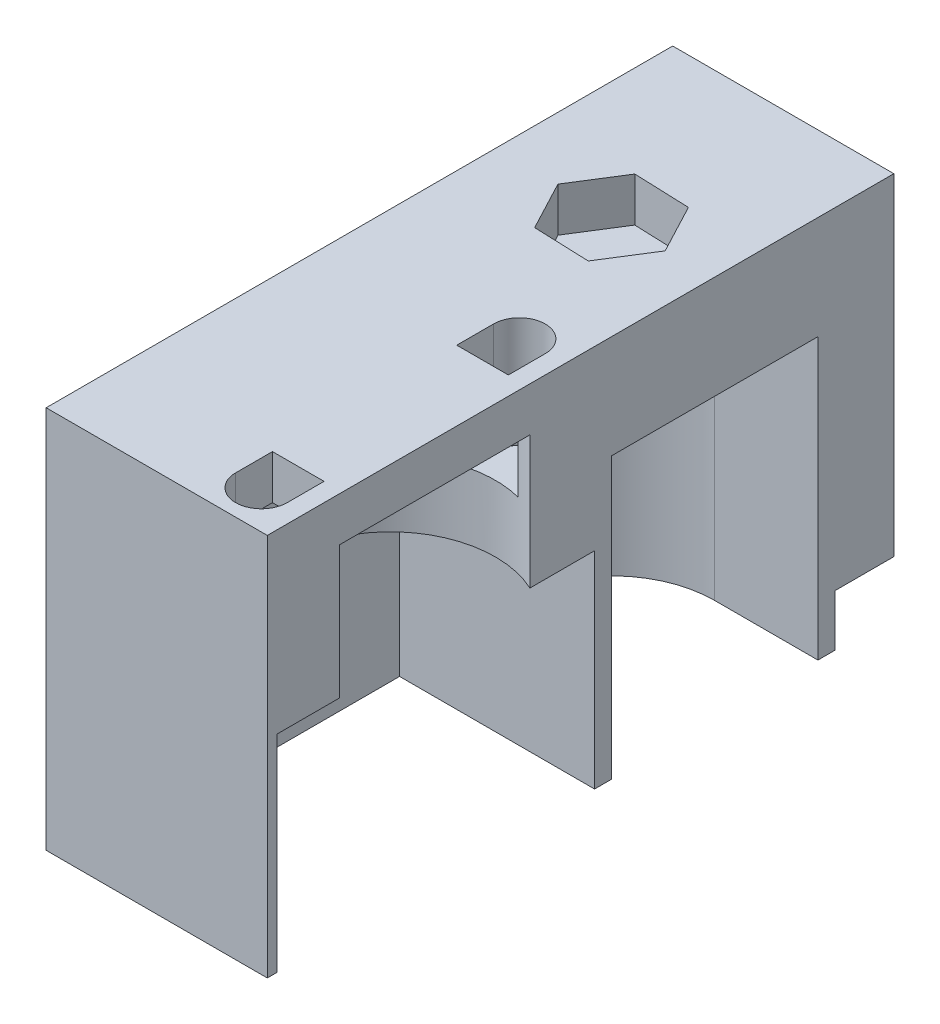
ISO-10303-21;
HEADER;
FILE_DESCRIPTION(('STEP AP214'),'2;1');
FILE_NAME('part.step','',(''),(''),'','','');
FILE_SCHEMA(('AUTOMOTIVE_DESIGN { 1 0 10303 214 1 1 1 1 }'));
ENDSEC;
DATA;
#1=APPLICATION_CONTEXT('core data for automotive mechanical design processes');
#2=APPLICATION_PROTOCOL_DEFINITION('international standard','automotive_design',2000,#1);
#3=PRODUCT_CONTEXT('',#1,'mechanical');
#4=PRODUCT('Part','Part','',(#3));
#5=PRODUCT_RELATED_PRODUCT_CATEGORY('part','',(#4));
#6=PRODUCT_DEFINITION_FORMATION('','',#4);
#7=PRODUCT_DEFINITION_CONTEXT('part definition',#1,'design');
#8=PRODUCT_DEFINITION('design','',#6,#7);
#9=PRODUCT_DEFINITION_SHAPE('','',#8);
#10=(LENGTH_UNIT() NAMED_UNIT(*) SI_UNIT(.MILLI.,.METRE.));
#11=(NAMED_UNIT(*) PLANE_ANGLE_UNIT() SI_UNIT($,.RADIAN.));
#12=(NAMED_UNIT(*) SI_UNIT($,.STERADIAN.) SOLID_ANGLE_UNIT());
#13=UNCERTAINTY_MEASURE_WITH_UNIT(LENGTH_MEASURE(1.E-05),#10,'distance_accuracy_value','');
#14=(GEOMETRIC_REPRESENTATION_CONTEXT(3) GLOBAL_UNCERTAINTY_ASSIGNED_CONTEXT((#13)) GLOBAL_UNIT_ASSIGNED_CONTEXT((#10,
#11,#12)) REPRESENTATION_CONTEXT('',''));
#15=CARTESIAN_POINT('',(0.,0.,0.));
#16=DIRECTION('',(0.,0.,1.));
#17=DIRECTION('',(1.,0.,0.));
#18=AXIS2_PLACEMENT_3D('',#15,#16,#17);
#19=CARTESIAN_POINT('',(-470.,56.,85.));
#20=DIRECTION('',(-1.,0.,0.));
#21=DIRECTION('',(0.,0.,1.));
#22=AXIS2_PLACEMENT_3D('',#19,#20,#21);
#23=PLANE('',#22);
#24=DIRECTION('',(0.,0.,-1.));
#25=VECTOR('',#24,1.);
#26=CARTESIAN_POINT('',(-470.,11.,8.));
#27=LINE('',#26,#25);
#28=CARTESIAN_POINT('',(-470.,11.,8.));
#29=VERTEX_POINT('',#28);
#30=CARTESIAN_POINT('',(-470.,11.,0.));
#31=VERTEX_POINT('',#30);
#32=EDGE_CURVE('E287',#29,#31,#27,.T.);
#33=ORIENTED_EDGE('',*,*,#32,.T.);
#34=DIRECTION('',(0.,1.,0.));
#35=VECTOR('',#34,1.);
#36=CARTESIAN_POINT('',(-470.,56.,0.));
#37=LINE('',#36,#35);
#38=CARTESIAN_POINT('',(-470.,56.,0.));
#39=VERTEX_POINT('',#38);
#40=EDGE_CURVE('E493',#31,#39,#37,.T.);
#41=ORIENTED_EDGE('',*,*,#40,.T.);
#42=DIRECTION('',(0.,0.,-1.));
#43=VECTOR('',#42,1.);
#44=CARTESIAN_POINT('',(-470.,56.,85.));
#45=LINE('',#44,#43);
#46=CARTESIAN_POINT('',(-470.,56.,85.));
#47=VERTEX_POINT('',#46);
#48=EDGE_CURVE('E498',#47,#39,#45,.T.);
#49=ORIENTED_EDGE('',*,*,#48,.F.);
#50=DIRECTION('',(0.,1.,0.));
#51=VECTOR('',#50,1.);
#52=CARTESIAN_POINT('',(-470.,56.,85.));
#53=LINE('',#52,#51);
#54=CARTESIAN_POINT('',(-470.,3.99999999999999,85.));
#55=VERTEX_POINT('',#54);
#56=EDGE_CURVE('E483',#55,#47,#53,.T.);
#57=ORIENTED_EDGE('',*,*,#56,.F.);
#58=DIRECTION('',(0.,0.,-1.));
#59=VECTOR('',#58,1.);
#60=CARTESIAN_POINT('',(-470.,3.99999999999999,85.));
#61=LINE('',#60,#59);
#62=CARTESIAN_POINT('',(-470.,3.99999999999999,83.7));
#63=VERTEX_POINT('',#62);
#64=EDGE_CURVE('E501',#55,#63,#61,.T.);
#65=ORIENTED_EDGE('',*,*,#64,.T.);
#66=DIRECTION('',(0.,-1.,0.));
#67=VECTOR('',#66,1.);
#68=CARTESIAN_POINT('',(-470.,32.,83.7));
#69=LINE('',#68,#67);
#70=CARTESIAN_POINT('',(-470.,32.,83.7));
#71=VERTEX_POINT('',#70);
#72=EDGE_CURVE('E350',#71,#63,#69,.T.);
#73=ORIENTED_EDGE('',*,*,#72,.F.);
#74=DIRECTION('',(0.,0.,1.));
#75=VECTOR('',#74,1.);
#76=CARTESIAN_POINT('',(-470.,32.,83.7));
#77=LINE('',#76,#75);
#78=CARTESIAN_POINT('',(-470.,32.,75.2261474256811));
#79=VERTEX_POINT('',#78);
#80=EDGE_CURVE('E334',#79,#71,#77,.T.);
#81=ORIENTED_EDGE('',*,*,#80,.F.);
#82=DIRECTION('',(0.,1.,0.));
#83=VECTOR('',#82,1.);
#84=CARTESIAN_POINT('',(-470.,-1.00000000000003,75.2261474256811));
#85=LINE('',#84,#83);
#86=CARTESIAN_POINT('',(-470.,50.,75.2261474256811));
#87=VERTEX_POINT('',#86);
#88=EDGE_CURVE('E514',#79,#87,#85,.T.);
#89=ORIENTED_EDGE('',*,*,#88,.T.);
#90=DIRECTION('',(0.,0.,-1.));
#91=VECTOR('',#90,1.);
#92=CARTESIAN_POINT('',(-470.,50.,85.));
#93=LINE('',#92,#91);
#94=CARTESIAN_POINT('',(-470.,50.,49.3738525743189));
#95=VERTEX_POINT('',#94);
#96=EDGE_CURVE('E508',#87,#95,#93,.T.);
#97=ORIENTED_EDGE('',*,*,#96,.T.);
#98=DIRECTION('',(0.,1.,0.));
#99=VECTOR('',#98,1.);
#100=CARTESIAN_POINT('',(-470.,-1.00000000000003,49.3738525743189));
#101=LINE('',#100,#99);
#102=CARTESIAN_POINT('',(-470.,32.,49.3738525743189));
#103=VERTEX_POINT('',#102);
#104=EDGE_CURVE('E511',#95,#103,#101,.F.);
#105=ORIENTED_EDGE('',*,*,#104,.T.);
#106=CARTESIAN_POINT('',(-470.,32.,40.6));
#107=VERTEX_POINT('',#106);
#108=EDGE_CURVE('E335',#107,#103,#77,.T.);
#109=ORIENTED_EDGE('',*,*,#108,.F.);
#110=DIRECTION('',(0.,-1.,0.));
#111=VECTOR('',#110,1.);
#112=CARTESIAN_POINT('',(-470.,32.,40.6));
#113=LINE('',#112,#111);
#114=CARTESIAN_POINT('',(-470.,3.99999999999999,40.6));
#115=VERTEX_POINT('',#114);
#116=EDGE_CURVE('E352',#107,#115,#113,.T.);
#117=ORIENTED_EDGE('',*,*,#116,.T.);
#118=CARTESIAN_POINT('',(-470.,4.,38.2986098280809));
#119=VERTEX_POINT('',#118);
#120=EDGE_CURVE('E505',#115,#119,#61,.T.);
#121=ORIENTED_EDGE('',*,*,#120,.T.);
#122=DIRECTION('',(0.,1.,0.));
#123=VECTOR('',#122,1.);
#124=CARTESIAN_POINT('',(-470.,56.,38.2986098280809));
#125=LINE('',#124,#123);
#126=CARTESIAN_POINT('',(-470.,42.,38.2986098280809));
#127=VERTEX_POINT('',#126);
#128=EDGE_CURVE('E543',#119,#127,#125,.T.);
#129=ORIENTED_EDGE('',*,*,#128,.T.);
#130=DIRECTION('',(0.,0.,-1.));
#131=VECTOR('',#130,1.);
#132=CARTESIAN_POINT('',(-470.,42.,85.));
#133=LINE('',#132,#131);
#134=CARTESIAN_POINT('',(-470.,42.,10.2986098280809));
#135=VERTEX_POINT('',#134);
#136=EDGE_CURVE('E540',#127,#135,#133,.T.);
#137=ORIENTED_EDGE('',*,*,#136,.T.);
#138=DIRECTION('',(0.,-1.,0.));
#139=VECTOR('',#138,1.);
#140=CARTESIAN_POINT('',(-470.,56.,10.2986098280809));
#141=LINE('',#140,#139);
#142=CARTESIAN_POINT('',(-470.,4.,10.2986098280809));
#143=VERTEX_POINT('',#142);
#144=EDGE_CURVE('E55',#135,#143,#141,.T.);
#145=ORIENTED_EDGE('',*,*,#144,.T.);
#146=CARTESIAN_POINT('',(-470.,3.99999999999999,8.));
#147=VERTEX_POINT('',#146);
#148=EDGE_CURVE('E299',#143,#147,#61,.T.);
#149=ORIENTED_EDGE('',*,*,#148,.T.);
#150=DIRECTION('',(0.,1.,0.));
#151=VECTOR('',#150,1.);
#152=CARTESIAN_POINT('',(-470.,3.99999999999999,8.));
#153=LINE('',#152,#151);
#154=EDGE_CURVE('E280',#147,#29,#153,.T.);
#155=ORIENTED_EDGE('',*,*,#154,.T.);
#156=EDGE_LOOP('',(#33,#41,#49,#57,#65,#73,#81,#89,#97,#105,#109,#117,#121,#129,#137,#145,#149,#155));
#157=FACE_BOUND('',#156,.T.);
#158=ADVANCED_FACE('F47',(#157),#23,.F.);
#159=CARTESIAN_POINT('',(0.,0.,0.));
#160=DIRECTION('',(0.,0.,1.));
#161=DIRECTION('',(1.,0.,0.));
#162=AXIS2_PLACEMENT_3D('',#159,#160,#161);
#163=PLANE('',#162);
#164=DIRECTION('',(-1.,0.,0.));
#165=VECTOR('',#164,1.);
#166=CARTESIAN_POINT('',(-470.,11.,0.));
#167=LINE('',#166,#165);
#168=CARTESIAN_POINT('',(-495.,11.,0.));
#169=VERTEX_POINT('',#168);
#170=EDGE_CURVE('E290',#31,#169,#167,.T.);
#171=ORIENTED_EDGE('',*,*,#170,.T.);
#172=DIRECTION('',(0.,1.,0.));
#173=VECTOR('',#172,1.);
#174=CARTESIAN_POINT('',(-495.,3.99999999999999,0.));
#175=LINE('',#174,#173);
#176=CARTESIAN_POINT('',(-495.,3.99999999999999,0.));
#177=VERTEX_POINT('',#176);
#178=EDGE_CURVE('E300',#177,#169,#175,.T.);
#179=ORIENTED_EDGE('',*,*,#178,.F.);
#180=DIRECTION('',(1.,0.,0.));
#181=VECTOR('',#180,1.);
#182=CARTESIAN_POINT('',(-500.,3.99999999999999,0.));
#183=LINE('',#182,#181);
#184=CARTESIAN_POINT('',(-500.,3.99999999999999,0.));
#185=VERTEX_POINT('',#184);
#186=EDGE_CURVE('E490',#185,#177,#183,.T.);
#187=ORIENTED_EDGE('',*,*,#186,.F.);
#188=DIRECTION('',(0.,-1.,0.));
#189=VECTOR('',#188,1.);
#190=CARTESIAN_POINT('',(-500.,56.,0.));
#191=LINE('',#190,#189);
#192=CARTESIAN_POINT('',(-500.,56.,0.));
#193=VERTEX_POINT('',#192);
#194=EDGE_CURVE('E475',#193,#185,#191,.T.);
#195=ORIENTED_EDGE('',*,*,#194,.F.);
#196=DIRECTION('',(-1.,0.,0.));
#197=VECTOR('',#196,1.);
#198=CARTESIAN_POINT('',(-500.,56.,0.));
#199=LINE('',#198,#197);
#200=EDGE_CURVE('E481',#39,#193,#199,.T.);
#201=ORIENTED_EDGE('',*,*,#200,.F.);
#202=ORIENTED_EDGE('',*,*,#40,.F.);
#203=EDGE_LOOP('',(#171,#179,#187,#195,#201,#202));
#204=FACE_BOUND('',#203,.T.);
#205=ADVANCED_FACE('F573',(#204),#163,.F.);
#206=CARTESIAN_POINT('',(-475.998100760204,-1.00000000000003,62.3));
#207=DIRECTION('',(0.,1.,0.));
#208=DIRECTION('',(0.,0.,1.));
#209=AXIS2_PLACEMENT_3D('',#206,#207,#208);
#210=CYLINDRICAL_SURFACE('',#209,14.25);
#211=CARTESIAN_POINT('',(-475.998100760204,32.,62.3));
#212=DIRECTION('',(0.,-1.,0.));
#213=DIRECTION('',(1.,0.,0.));
#214=AXIS2_PLACEMENT_3D('',#211,#212,#213);
#215=CIRCLE('',#214,14.25);
#216=EDGE_CURVE('E538',#103,#79,#215,.F.);
#217=ORIENTED_EDGE('',*,*,#216,.F.);
#218=ORIENTED_EDGE('',*,*,#104,.F.);
#219=CARTESIAN_POINT('',(-475.998100760204,50.,62.3));
#220=DIRECTION('',(0.,1.,0.));
#221=DIRECTION('',(0.,0.,1.));
#222=AXIS2_PLACEMENT_3D('',#219,#220,#221);
#223=CIRCLE('',#222,14.25);
#224=CARTESIAN_POINT('',(-472.498100760204,50.,48.4865102164587));
#225=VERTEX_POINT('',#224);
#226=EDGE_CURVE('E472',#95,#225,#223,.T.);
#227=ORIENTED_EDGE('',*,*,#226,.T.);
#228=DIRECTION('',(0.,1.,0.));
#229=VECTOR('',#228,1.);
#230=CARTESIAN_POINT('',(-472.498100760204,-1.00000000000003,48.4865102164587));
#231=LINE('',#230,#229);
#232=CARTESIAN_POINT('',(-472.498100760204,41.,48.4865102164587));
#233=VERTEX_POINT('',#232);
#234=EDGE_CURVE('E420',#225,#233,#231,.F.);
#235=ORIENTED_EDGE('',*,*,#234,.T.);
#236=CARTESIAN_POINT('',(-475.998100760204,41.,62.3));
#237=DIRECTION('',(0.,1.,0.));
#238=DIRECTION('',(0.,0.,1.));
#239=AXIS2_PLACEMENT_3D('',#236,#237,#238);
#240=CIRCLE('',#239,14.25);
#241=CARTESIAN_POINT('',(-479.498100760204,41.,48.4865102164587));
#242=VERTEX_POINT('',#241);
#243=EDGE_CURVE('E525',#242,#233,#240,.F.);
#244=ORIENTED_EDGE('',*,*,#243,.F.);
#245=DIRECTION('',(0.,1.,0.));
#246=VECTOR('',#245,1.);
#247=CARTESIAN_POINT('',(-479.498100760204,-1.00000000000003,48.4865102164587));
#248=LINE('',#247,#246);
#249=CARTESIAN_POINT('',(-479.498100760204,50.,48.4865102164587));
#250=VERTEX_POINT('',#249);
#251=EDGE_CURVE('E411',#242,#250,#248,.T.);
#252=ORIENTED_EDGE('',*,*,#251,.T.);
#253=CARTESIAN_POINT('',(-479.498100760204,50.,76.1134897835413));
#254=VERTEX_POINT('',#253);
#255=EDGE_CURVE('E476',#250,#254,#223,.T.);
#256=ORIENTED_EDGE('',*,*,#255,.T.);
#257=DIRECTION('',(0.,1.,0.));
#258=VECTOR('',#257,1.);
#259=CARTESIAN_POINT('',(-479.498100760204,-1.00000000000003,76.1134897835413));
#260=LINE('',#259,#258);
#261=CARTESIAN_POINT('',(-479.498100760204,41.,76.1134897835413));
#262=VERTEX_POINT('',#261);
#263=EDGE_CURVE('E386',#254,#262,#260,.F.);
#264=ORIENTED_EDGE('',*,*,#263,.T.);
#265=CARTESIAN_POINT('',(-475.998100760204,41.,62.3));
#266=DIRECTION('',(0.,1.,0.));
#267=DIRECTION('',(0.,0.,1.));
#268=AXIS2_PLACEMENT_3D('',#265,#266,#267);
#269=CIRCLE('',#268,14.25);
#270=CARTESIAN_POINT('',(-472.498100760204,41.,76.1134897835413));
#271=VERTEX_POINT('',#270);
#272=EDGE_CURVE('E536',#271,#262,#269,.F.);
#273=ORIENTED_EDGE('',*,*,#272,.F.);
#274=DIRECTION('',(0.,1.,0.));
#275=VECTOR('',#274,1.);
#276=CARTESIAN_POINT('',(-472.498100760204,-1.00000000000003,76.1134897835413));
#277=LINE('',#276,#275);
#278=CARTESIAN_POINT('',(-472.498100760204,50.,76.1134897835413));
#279=VERTEX_POINT('',#278);
#280=EDGE_CURVE('E377',#271,#279,#277,.T.);
#281=ORIENTED_EDGE('',*,*,#280,.T.);
#282=EDGE_CURVE('E461',#279,#87,#223,.T.);
#283=ORIENTED_EDGE('',*,*,#282,.T.);
#284=ORIENTED_EDGE('',*,*,#88,.F.);
#285=EDGE_LOOP('',(#217,#218,#227,#235,#244,#252,#256,#264,#273,#281,#283,#284));
#286=FACE_BOUND('',#285,.T.);
#287=ADVANCED_FACE('F578',(#286),#210,.F.);
#288=CARTESIAN_POINT('',(-500.,56.,85.));
#289=DIRECTION('',(1.,0.,0.));
#290=DIRECTION('',(0.,0.,-1.));
#291=AXIS2_PLACEMENT_3D('',#288,#289,#290);
#292=PLANE('',#291);
#293=ORIENTED_EDGE('',*,*,#194,.T.);
#294=DIRECTION('',(0.,0.,-1.));
#295=VECTOR('',#294,1.);
#296=CARTESIAN_POINT('',(-500.,3.99999999999999,85.));
#297=LINE('',#296,#295);
#298=CARTESIAN_POINT('',(-500.,3.99999999999999,85.));
#299=VERTEX_POINT('',#298);
#300=EDGE_CURVE('E504',#299,#185,#297,.T.);
#301=ORIENTED_EDGE('',*,*,#300,.F.);
#302=DIRECTION('',(0.,-1.,0.));
#303=VECTOR('',#302,1.);
#304=CARTESIAN_POINT('',(-500.,56.,85.));
#305=LINE('',#304,#303);
#306=CARTESIAN_POINT('',(-500.,56.,85.));
#307=VERTEX_POINT('',#306);
#308=EDGE_CURVE('E477',#307,#299,#305,.T.);
#309=ORIENTED_EDGE('',*,*,#308,.F.);
#310=DIRECTION('',(0.,0.,-1.));
#311=VECTOR('',#310,1.);
#312=CARTESIAN_POINT('',(-500.,56.,85.));
#313=LINE('',#312,#311);
#314=EDGE_CURVE('E487',#307,#193,#313,.T.);
#315=ORIENTED_EDGE('',*,*,#314,.T.);
#316=EDGE_LOOP('',(#293,#301,#309,#315));
#317=FACE_BOUND('',#316,.T.);
#318=ADVANCED_FACE('F49',(#317),#292,.F.);
#319=CARTESIAN_POINT('',(-500.,3.99999999999999,85.));
#320=DIRECTION('',(0.,1.,0.));
#321=DIRECTION('',(-1.,0.,0.));
#322=AXIS2_PLACEMENT_3D('',#319,#320,#321);
#323=PLANE('',#322);
#324=ORIENTED_EDGE('',*,*,#186,.T.);
#325=DIRECTION('',(0.,0.,-1.));
#326=VECTOR('',#325,1.);
#327=CARTESIAN_POINT('',(-495.,3.99999999999999,8.));
#328=LINE('',#327,#326);
#329=CARTESIAN_POINT('',(-495.,3.99999999999999,8.));
#330=VERTEX_POINT('',#329);
#331=EDGE_CURVE('E62',#330,#177,#328,.T.);
#332=ORIENTED_EDGE('',*,*,#331,.F.);
#333=DIRECTION('',(-1.,0.,0.));
#334=VECTOR('',#333,1.);
#335=CARTESIAN_POINT('',(-470.,3.99999999999999,8.));
#336=LINE('',#335,#334);
#337=EDGE_CURVE('E305',#147,#330,#336,.T.);
#338=ORIENTED_EDGE('',*,*,#337,.F.);
#339=ORIENTED_EDGE('',*,*,#148,.F.);
#340=DIRECTION('',(-1.,0.,0.));
#341=VECTOR('',#340,1.);
#342=CARTESIAN_POINT('',(-500.,3.99999999999999,10.2986098280809));
#343=LINE('',#342,#341);
#344=CARTESIAN_POINT('',(-484.,3.99999999999999,10.2986098280809));
#345=VERTEX_POINT('',#344);
#346=EDGE_CURVE('E323',#143,#345,#343,.T.);
#347=ORIENTED_EDGE('',*,*,#346,.T.);
#348=CARTESIAN_POINT('',(-484.,3.99999999999999,24.2986098280809));
#349=DIRECTION('',(0.,1.,0.));
#350=DIRECTION('',(-1.,0.,0.));
#351=AXIS2_PLACEMENT_3D('',#348,#349,#350);
#352=CIRCLE('',#351,14.);
#353=CARTESIAN_POINT('',(-484.,3.99999999999999,38.2986098280809));
#354=VERTEX_POINT('',#353);
#355=EDGE_CURVE('E13',#345,#354,#352,.T.);
#356=ORIENTED_EDGE('',*,*,#355,.T.);
#357=DIRECTION('',(1.,0.,0.));
#358=VECTOR('',#357,1.);
#359=CARTESIAN_POINT('',(-500.,3.99999999999999,38.2986098280809));
#360=LINE('',#359,#358);
#361=EDGE_CURVE('E319',#354,#119,#360,.T.);
#362=ORIENTED_EDGE('',*,*,#361,.T.);
#363=ORIENTED_EDGE('',*,*,#120,.F.);
#364=DIRECTION('',(1.,0.,0.));
#365=VECTOR('',#364,1.);
#366=CARTESIAN_POINT('',(-496.454461606459,3.99999999999999,40.6));
#367=LINE('',#366,#365);
#368=CARTESIAN_POINT('',(-496.454461606459,3.99999999999999,40.6));
#369=VERTEX_POINT('',#368);
#370=EDGE_CURVE('E343',#369,#115,#367,.T.);
#371=ORIENTED_EDGE('',*,*,#370,.F.);
#372=DIRECTION('',(0.,0.,-1.));
#373=VECTOR('',#372,1.);
#374=CARTESIAN_POINT('',(-496.454461606459,3.99999999999999,83.7));
#375=LINE('',#374,#373);
#376=CARTESIAN_POINT('',(-496.454461606459,3.99999999999999,83.7));
#377=VERTEX_POINT('',#376);
#378=EDGE_CURVE('E326',#377,#369,#375,.T.);
#379=ORIENTED_EDGE('',*,*,#378,.F.);
#380=DIRECTION('',(-1.,0.,0.));
#381=VECTOR('',#380,1.);
#382=CARTESIAN_POINT('',(-496.454461606459,3.99999999999999,83.7));
#383=LINE('',#382,#381);
#384=EDGE_CURVE('E331',#63,#377,#383,.T.);
#385=ORIENTED_EDGE('',*,*,#384,.F.);
#386=ORIENTED_EDGE('',*,*,#64,.F.);
#387=DIRECTION('',(1.,0.,0.));
#388=VECTOR('',#387,1.);
#389=CARTESIAN_POINT('',(-500.,3.99999999999999,85.));
#390=LINE('',#389,#388);
#391=EDGE_CURVE('E480',#299,#55,#390,.T.);
#392=ORIENTED_EDGE('',*,*,#391,.F.);
#393=ORIENTED_EDGE('',*,*,#300,.T.);
#394=EDGE_LOOP('',(#324,#332,#338,#339,#347,#356,#362,#363,#371,#379,#385,#386,#392,#393));
#395=FACE_BOUND('',#394,.T.);
#396=ADVANCED_FACE('F547',(#395),#323,.F.);
#397=CARTESIAN_POINT('',(-500.,56.,85.));
#398=DIRECTION('',(0.,-1.,0.));
#399=DIRECTION('',(0.,0.,-1.));
#400=AXIS2_PLACEMENT_3D('',#397,#398,#399);
#401=PLANE('',#400);
#402=DIRECTION('',(0.,0.,-1.));
#403=VECTOR('',#402,1.);
#404=CARTESIAN_POINT('',(-472.498100760204,56.,79.7999999999999));
#405=LINE('',#404,#403);
#406=CARTESIAN_POINT('',(-472.498100760204,56.,79.7999999999999));
#407=VERTEX_POINT('',#406);
#408=CARTESIAN_POINT('',(-472.498100760204,56.,74.7999999999999));
#409=VERTEX_POINT('',#408);
#410=EDGE_CURVE('E367',#407,#409,#405,.T.);
#411=ORIENTED_EDGE('',*,*,#410,.F.);
#412=CARTESIAN_POINT('',(-475.998100760204,56.,79.7999999999999));
#413=DIRECTION('',(0.,1.,0.));
#414=DIRECTION('',(0.,0.,1.));
#415=AXIS2_PLACEMENT_3D('',#412,#413,#414);
#416=CIRCLE('',#415,3.5);
#417=CARTESIAN_POINT('',(-479.498100760204,56.,79.7999999999999));
#418=VERTEX_POINT('',#417);
#419=EDGE_CURVE('E349',#418,#407,#416,.T.);
#420=ORIENTED_EDGE('',*,*,#419,.F.);
#421=DIRECTION('',(0.,0.,1.));
#422=VECTOR('',#421,1.);
#423=CARTESIAN_POINT('',(-479.498100760204,56.,79.7999999999999));
#424=LINE('',#423,#422);
#425=CARTESIAN_POINT('',(-479.498100760204,56.,74.7999999999999));
#426=VERTEX_POINT('',#425);
#427=EDGE_CURVE('E360',#426,#418,#424,.T.);
#428=ORIENTED_EDGE('',*,*,#427,.F.);
#429=DIRECTION('',(-1.,0.,0.));
#430=VECTOR('',#429,1.);
#431=CARTESIAN_POINT('',(-472.498100760204,56.,74.7999999999999));
#432=LINE('',#431,#430);
#433=EDGE_CURVE('E370',#409,#426,#432,.T.);
#434=ORIENTED_EDGE('',*,*,#433,.F.);
#435=EDGE_LOOP('',(#411,#420,#428,#434));
#436=FACE_BOUND('',#435,.T.);
#437=DIRECTION('',(0.,0.,1.));
#438=VECTOR('',#437,1.);
#439=CARTESIAN_POINT('',(-479.498100760204,56.,44.8));
#440=LINE('',#439,#438);
#441=CARTESIAN_POINT('',(-479.498100760204,56.,44.8));
#442=VERTEX_POINT('',#441);
#443=CARTESIAN_POINT('',(-479.498100760204,56.,49.8));
#444=VERTEX_POINT('',#443);
#445=EDGE_CURVE('E401',#442,#444,#440,.T.);
#446=ORIENTED_EDGE('',*,*,#445,.F.);
#447=CARTESIAN_POINT('',(-475.998100760204,56.,44.8));
#448=DIRECTION('',(0.,1.,0.));
#449=DIRECTION('',(0.,0.,1.));
#450=AXIS2_PLACEMENT_3D('',#447,#448,#449);
#451=CIRCLE('',#450,3.5);
#452=CARTESIAN_POINT('',(-472.498100760204,56.,44.8));
#453=VERTEX_POINT('',#452);
#454=EDGE_CURVE('E389',#453,#442,#451,.T.);
#455=ORIENTED_EDGE('',*,*,#454,.F.);
#456=DIRECTION('',(0.,0.,-1.));
#457=VECTOR('',#456,1.);
#458=CARTESIAN_POINT('',(-472.498100760204,56.,44.8));
#459=LINE('',#458,#457);
#460=CARTESIAN_POINT('',(-472.498100760204,56.,49.8));
#461=VERTEX_POINT('',#460);
#462=EDGE_CURVE('E394',#461,#453,#459,.T.);
#463=ORIENTED_EDGE('',*,*,#462,.F.);
#464=DIRECTION('',(1.,0.,0.));
#465=VECTOR('',#464,1.);
#466=CARTESIAN_POINT('',(-479.498100760204,56.,49.8));
#467=LINE('',#466,#465);
#468=EDGE_CURVE('E404',#444,#461,#467,.T.);
#469=ORIENTED_EDGE('',*,*,#468,.F.);
#470=EDGE_LOOP('',(#446,#455,#463,#469));
#471=FACE_BOUND('',#470,.T.);
#472=DIRECTION('',(0.999287168563189,0.,0.0377512217678455));
#473=VECTOR('',#472,1.);
#474=CARTESIAN_POINT('',(-488.026219090858,56.,30.7011790909429));
#475=LINE('',#474,#473);
#476=CARTESIAN_POINT('',(-488.026219090858,56.,30.7011790909429));
#477=VERTEX_POINT('',#476);
#478=CARTESIAN_POINT('',(-480.468321914301,56.,30.9867024733967));
#479=VERTEX_POINT('',#478);
#480=EDGE_CURVE('E445',#477,#479,#475,.T.);
#481=ORIENTED_EDGE('',*,*,#480,.F.);
#482=DIRECTION('',(0.466950067206738,0.,0.884283684535468));
#483=VECTOR('',#482,1.);
#484=CARTESIAN_POINT('',(-491.557897176557,56.,24.0130864456271));
#485=LINE('',#484,#483);
#486=CARTESIAN_POINT('',(-491.557897176557,56.,24.0130864456271));
#487=VERTEX_POINT('',#486);
#488=EDGE_CURVE('E423',#487,#477,#485,.T.);
#489=ORIENTED_EDGE('',*,*,#488,.F.);
#490=DIRECTION('',(-0.532337101356447,0.,0.846532462767622));
#491=VECTOR('',#490,1.);
#492=CARTESIAN_POINT('',(-487.531678085699,56.,17.610517182765));
#493=LINE('',#492,#491);
#494=CARTESIAN_POINT('',(-487.531678085699,56.,17.610517182765));
#495=VERTEX_POINT('',#494);
#496=EDGE_CURVE('E428',#495,#487,#493,.T.);
#497=ORIENTED_EDGE('',*,*,#496,.F.);
#498=DIRECTION('',(-0.999287168563189,0.,-0.0377512217678458));
#499=VECTOR('',#498,1.);
#500=CARTESIAN_POINT('',(-479.973780909142,56.,17.8960405652188));
#501=LINE('',#500,#499);
#502=CARTESIAN_POINT('',(-479.973780909142,56.,17.8960405652188));
#503=VERTEX_POINT('',#502);
#504=EDGE_CURVE('E454',#503,#495,#501,.T.);
#505=ORIENTED_EDGE('',*,*,#504,.F.);
#506=DIRECTION('',(-0.466950067206742,0.,-0.884283684535466));
#507=VECTOR('',#506,1.);
#508=CARTESIAN_POINT('',(-476.442102823443,56.,24.5841332105346));
#509=LINE('',#508,#507);
#510=CARTESIAN_POINT('',(-476.442102823443,56.,24.5841332105346));
#511=VERTEX_POINT('',#510);
#512=EDGE_CURVE('E451',#511,#503,#509,.T.);
#513=ORIENTED_EDGE('',*,*,#512,.F.);
#514=DIRECTION('',(0.532337101356449,0.,-0.846532462767621));
#515=VECTOR('',#514,1.);
#516=CARTESIAN_POINT('',(-480.468321914301,56.,30.9867024733967));
#517=LINE('',#516,#515);
#518=EDGE_CURVE('E448',#479,#511,#517,.T.);
#519=ORIENTED_EDGE('',*,*,#518,.F.);
#520=EDGE_LOOP('',(#481,#489,#497,#505,#513,#519));
#521=FACE_BOUND('',#520,.T.);
#522=ORIENTED_EDGE('',*,*,#200,.T.);
#523=ORIENTED_EDGE('',*,*,#314,.F.);
#524=DIRECTION('',(-1.,0.,0.));
#525=VECTOR('',#524,1.);
#526=CARTESIAN_POINT('',(-500.,56.,85.));
#527=LINE('',#526,#525);
#528=EDGE_CURVE('E485',#47,#307,#527,.T.);
#529=ORIENTED_EDGE('',*,*,#528,.F.);
#530=ORIENTED_EDGE('',*,*,#48,.T.);
#531=EDGE_LOOP('',(#522,#523,#529,#530));
#532=FACE_BOUND('',#531,.T.);
#533=ADVANCED_FACE('F582',(#436,#471,#521,#532),#401,.F.);
#534=CARTESIAN_POINT('',(0.,0.,85.));
#535=DIRECTION('',(0.,0.,1.));
#536=DIRECTION('',(1.,0.,0.));
#537=AXIS2_PLACEMENT_3D('',#534,#535,#536);
#538=PLANE('',#537);
#539=ORIENTED_EDGE('',*,*,#308,.T.);
#540=ORIENTED_EDGE('',*,*,#391,.T.);
#541=ORIENTED_EDGE('',*,*,#56,.T.);
#542=ORIENTED_EDGE('',*,*,#528,.T.);
#543=EDGE_LOOP('',(#539,#540,#541,#542));
#544=FACE_BOUND('',#543,.T.);
#545=ADVANCED_FACE('F588',(#544),#538,.T.);
#546=CARTESIAN_POINT('',(-475.998100760204,50.,62.3));
#547=DIRECTION('',(0.,1.,0.));
#548=DIRECTION('',(0.,0.,1.));
#549=AXIS2_PLACEMENT_3D('',#546,#547,#548);
#550=PLANE('',#549);
#551=DIRECTION('',(-1.,0.,0.));
#552=VECTOR('',#551,1.);
#553=CARTESIAN_POINT('',(-475.998100760204,50.,74.7999999999999));
#554=LINE('',#553,#552);
#555=CARTESIAN_POINT('',(-472.498100760204,50.,74.7999999999999));
#556=VERTEX_POINT('',#555);
#557=CARTESIAN_POINT('',(-479.498100760204,50.,74.7999999999999));
#558=VERTEX_POINT('',#557);
#559=EDGE_CURVE('E530',#556,#558,#554,.T.);
#560=ORIENTED_EDGE('',*,*,#559,.T.);
#561=DIRECTION('',(0.,0.,1.));
#562=VECTOR('',#561,1.);
#563=CARTESIAN_POINT('',(-479.498100760204,50.,62.3));
#564=LINE('',#563,#562);
#565=EDGE_CURVE('E533',#558,#254,#564,.T.);
#566=ORIENTED_EDGE('',*,*,#565,.T.);
#567=ORIENTED_EDGE('',*,*,#255,.F.);
#568=DIRECTION('',(0.,0.,1.));
#569=VECTOR('',#568,1.);
#570=CARTESIAN_POINT('',(-479.498100760204,50.,62.3));
#571=LINE('',#570,#569);
#572=CARTESIAN_POINT('',(-479.498100760204,50.,49.8));
#573=VERTEX_POINT('',#572);
#574=EDGE_CURVE('E516',#250,#573,#571,.T.);
#575=ORIENTED_EDGE('',*,*,#574,.T.);
#576=DIRECTION('',(1.,0.,0.));
#577=VECTOR('',#576,1.);
#578=CARTESIAN_POINT('',(-475.998100760204,50.,49.8));
#579=LINE('',#578,#577);
#580=CARTESIAN_POINT('',(-472.498100760204,50.,49.8));
#581=VERTEX_POINT('',#580);
#582=EDGE_CURVE('E519',#573,#581,#579,.T.);
#583=ORIENTED_EDGE('',*,*,#582,.T.);
#584=DIRECTION('',(0.,0.,-1.));
#585=VECTOR('',#584,1.);
#586=CARTESIAN_POINT('',(-472.498100760204,50.,62.3));
#587=LINE('',#586,#585);
#588=EDGE_CURVE('E522',#581,#225,#587,.T.);
#589=ORIENTED_EDGE('',*,*,#588,.T.);
#590=ORIENTED_EDGE('',*,*,#226,.F.);
#591=ORIENTED_EDGE('',*,*,#96,.F.);
#592=ORIENTED_EDGE('',*,*,#282,.F.);
#593=DIRECTION('',(0.,0.,-1.));
#594=VECTOR('',#593,1.);
#595=CARTESIAN_POINT('',(-472.498100760204,50.,62.3));
#596=LINE('',#595,#594);
#597=EDGE_CURVE('E527',#279,#556,#596,.T.);
#598=ORIENTED_EDGE('',*,*,#597,.T.);
#599=EDGE_LOOP('',(#560,#566,#567,#575,#583,#589,#590,#591,#592,#598));
#600=FACE_BOUND('',#599,.T.);
#601=ADVANCED_FACE('F626',(#600),#550,.F.);
#602=CARTESIAN_POINT('',(-491.557897176557,50.,24.0130864456271));
#603=DIRECTION('',(-0.884283684535468,0.,0.466950067206738));
#604=DIRECTION('',(0.466950067206738,0.,0.884283684535468));
#605=AXIS2_PLACEMENT_3D('',#602,#603,#604);
#606=PLANE('',#605);
#607=ORIENTED_EDGE('',*,*,#488,.T.);
#608=DIRECTION('',(0.,1.,0.));
#609=VECTOR('',#608,1.);
#610=CARTESIAN_POINT('',(-488.026219090858,50.,30.7011790909429));
#611=LINE('',#610,#609);
#612=CARTESIAN_POINT('',(-488.026219090858,50.,30.7011790909429));
#613=VERTEX_POINT('',#612);
#614=EDGE_CURVE('E443',#613,#477,#611,.T.);
#615=ORIENTED_EDGE('',*,*,#614,.F.);
#616=DIRECTION('',(0.466950067206738,0.,0.884283684535468));
#617=VECTOR('',#616,1.);
#618=CARTESIAN_POINT('',(-491.557897176557,50.,24.0130864456271));
#619=LINE('',#618,#617);
#620=CARTESIAN_POINT('',(-491.557897176557,50.,24.0130864456271));
#621=VERTEX_POINT('',#620);
#622=EDGE_CURVE('E424',#621,#613,#619,.T.);
#623=ORIENTED_EDGE('',*,*,#622,.F.);
#624=DIRECTION('',(0.,1.,0.));
#625=VECTOR('',#624,1.);
#626=CARTESIAN_POINT('',(-491.557897176557,50.,24.0130864456271));
#627=LINE('',#626,#625);
#628=EDGE_CURVE('E459',#621,#487,#627,.T.);
#629=ORIENTED_EDGE('',*,*,#628,.T.);
#630=EDGE_LOOP('',(#607,#615,#623,#629));
#631=FACE_BOUND('',#630,.T.);
#632=ADVANCED_FACE('F701',(#631),#606,.F.);
#633=CARTESIAN_POINT('',(-487.531678085699,50.,17.610517182765));
#634=DIRECTION('',(-0.846532462767623,0.,-0.532337101356447));
#635=DIRECTION('',(-0.532337101356447,0.,0.846532462767623));
#636=AXIS2_PLACEMENT_3D('',#633,#634,#635);
#637=PLANE('',#636);
#638=ORIENTED_EDGE('',*,*,#496,.T.);
#639=ORIENTED_EDGE('',*,*,#628,.F.);
#640=DIRECTION('',(-0.532337101356447,0.,0.846532462767622));
#641=VECTOR('',#640,1.);
#642=CARTESIAN_POINT('',(-487.531678085699,50.,17.610517182765));
#643=LINE('',#642,#641);
#644=CARTESIAN_POINT('',(-487.531678085699,50.,17.610517182765));
#645=VERTEX_POINT('',#644);
#646=EDGE_CURVE('E440',#645,#621,#643,.T.);
#647=ORIENTED_EDGE('',*,*,#646,.F.);
#648=DIRECTION('',(0.,1.,0.));
#649=VECTOR('',#648,1.);
#650=CARTESIAN_POINT('',(-487.531678085699,50.,17.610517182765));
#651=LINE('',#650,#649);
#652=EDGE_CURVE('E462',#645,#495,#651,.T.);
#653=ORIENTED_EDGE('',*,*,#652,.T.);
#654=EDGE_LOOP('',(#638,#639,#647,#653));
#655=FACE_BOUND('',#654,.T.);
#656=ADVANCED_FACE('F697',(#655),#637,.F.);
#657=CARTESIAN_POINT('',(-479.973780909142,50.,17.8960405652188));
#658=DIRECTION('',(0.0377512217678458,0.,-0.999287168563189));
#659=DIRECTION('',(-0.999287168563189,0.,-0.0377512217678458));
#660=AXIS2_PLACEMENT_3D('',#657,#658,#659);
#661=PLANE('',#660);
#662=ORIENTED_EDGE('',*,*,#504,.T.);
#663=ORIENTED_EDGE('',*,*,#652,.F.);
#664=DIRECTION('',(-0.999287168563189,0.,-0.0377512217678458));
#665=VECTOR('',#664,1.);
#666=CARTESIAN_POINT('',(-479.973780909142,50.,17.8960405652188));
#667=LINE('',#666,#665);
#668=CARTESIAN_POINT('',(-479.973780909142,50.,17.8960405652188));
#669=VERTEX_POINT('',#668);
#670=EDGE_CURVE('E437',#669,#645,#667,.T.);
#671=ORIENTED_EDGE('',*,*,#670,.F.);
#672=DIRECTION('',(0.,1.,0.));
#673=VECTOR('',#672,1.);
#674=CARTESIAN_POINT('',(-479.973780909142,50.,17.8960405652188));
#675=LINE('',#674,#673);
#676=EDGE_CURVE('E464',#669,#503,#675,.T.);
#677=ORIENTED_EDGE('',*,*,#676,.T.);
#678=EDGE_LOOP('',(#662,#663,#671,#677));
#679=FACE_BOUND('',#678,.T.);
#680=ADVANCED_FACE('F700',(#679),#661,.F.);
#681=CARTESIAN_POINT('',(-476.442102823443,50.,24.5841332105346));
#682=DIRECTION('',(0.884283684535466,0.,-0.466950067206742));
#683=DIRECTION('',(-0.466950067206742,0.,-0.884283684535466));
#684=AXIS2_PLACEMENT_3D('',#681,#682,#683);
#685=PLANE('',#684);
#686=ORIENTED_EDGE('',*,*,#512,.T.);
#687=ORIENTED_EDGE('',*,*,#676,.F.);
#688=DIRECTION('',(-0.466950067206742,0.,-0.884283684535466));
#689=VECTOR('',#688,1.);
#690=CARTESIAN_POINT('',(-476.442102823443,50.,24.5841332105346));
#691=LINE('',#690,#689);
#692=CARTESIAN_POINT('',(-476.442102823443,50.,24.5841332105346));
#693=VERTEX_POINT('',#692);
#694=EDGE_CURVE('E434',#693,#669,#691,.T.);
#695=ORIENTED_EDGE('',*,*,#694,.F.);
#696=DIRECTION('',(0.,1.,0.));
#697=VECTOR('',#696,1.);
#698=CARTESIAN_POINT('',(-476.442102823443,50.,24.5841332105346));
#699=LINE('',#698,#697);
#700=EDGE_CURVE('E466',#693,#511,#699,.T.);
#701=ORIENTED_EDGE('',*,*,#700,.T.);
#702=EDGE_LOOP('',(#686,#687,#695,#701));
#703=FACE_BOUND('',#702,.T.);
#704=ADVANCED_FACE('F705',(#703),#685,.F.);
#705=CARTESIAN_POINT('',(-480.468321914301,50.,30.9867024733967));
#706=DIRECTION('',(0.846532462767621,0.,0.532337101356449));
#707=DIRECTION('',(0.532337101356449,0.,-0.846532462767621));
#708=AXIS2_PLACEMENT_3D('',#705,#706,#707);
#709=PLANE('',#708);
#710=ORIENTED_EDGE('',*,*,#518,.T.);
#711=ORIENTED_EDGE('',*,*,#700,.F.);
#712=DIRECTION('',(0.532337101356449,0.,-0.846532462767621));
#713=VECTOR('',#712,1.);
#714=CARTESIAN_POINT('',(-480.468321914301,50.,30.9867024733967));
#715=LINE('',#714,#713);
#716=CARTESIAN_POINT('',(-480.468321914301,50.,30.9867024733967));
#717=VERTEX_POINT('',#716);
#718=EDGE_CURVE('E431',#717,#693,#715,.T.);
#719=ORIENTED_EDGE('',*,*,#718,.F.);
#720=DIRECTION('',(0.,1.,0.));
#721=VECTOR('',#720,1.);
#722=CARTESIAN_POINT('',(-480.468321914301,50.,30.9867024733967));
#723=LINE('',#722,#721);
#724=EDGE_CURVE('E468',#717,#479,#723,.T.);
#725=ORIENTED_EDGE('',*,*,#724,.T.);
#726=EDGE_LOOP('',(#710,#711,#719,#725));
#727=FACE_BOUND('',#726,.T.);
#728=ADVANCED_FACE('F709',(#727),#709,.F.);
#729=CARTESIAN_POINT('',(-488.026219090858,50.,30.7011790909429));
#730=DIRECTION('',(-0.0377512217678455,0.,0.999287168563189));
#731=DIRECTION('',(0.999287168563189,0.,0.0377512217678455));
#732=AXIS2_PLACEMENT_3D('',#729,#730,#731);
#733=PLANE('',#732);
#734=ORIENTED_EDGE('',*,*,#480,.T.);
#735=ORIENTED_EDGE('',*,*,#724,.F.);
#736=DIRECTION('',(0.999287168563189,0.,0.0377512217678455));
#737=VECTOR('',#736,1.);
#738=CARTESIAN_POINT('',(-488.026219090858,50.,30.7011790909429));
#739=LINE('',#738,#737);
#740=EDGE_CURVE('E427',#613,#717,#739,.T.);
#741=ORIENTED_EDGE('',*,*,#740,.F.);
#742=ORIENTED_EDGE('',*,*,#614,.T.);
#743=EDGE_LOOP('',(#734,#735,#741,#742));
#744=FACE_BOUND('',#743,.T.);
#745=ADVANCED_FACE('F695',(#744),#733,.F.);
#746=CARTESIAN_POINT('',(0.,50.,0.));
#747=DIRECTION('',(0.,1.,0.));
#748=DIRECTION('',(0.,0.,1.));
#749=AXIS2_PLACEMENT_3D('',#746,#747,#748);
#750=PLANE('',#749);
#751=ORIENTED_EDGE('',*,*,#622,.T.);
#752=ORIENTED_EDGE('',*,*,#740,.T.);
#753=ORIENTED_EDGE('',*,*,#718,.T.);
#754=ORIENTED_EDGE('',*,*,#694,.T.);
#755=ORIENTED_EDGE('',*,*,#670,.T.);
#756=ORIENTED_EDGE('',*,*,#646,.T.);
#757=EDGE_LOOP('',(#751,#752,#753,#754,#755,#756));
#758=FACE_BOUND('',#757,.T.);
#759=ADVANCED_FACE('F681',(#758),#750,.T.);
#760=CARTESIAN_POINT('',(-475.998100760204,41.,44.8));
#761=DIRECTION('',(0.,1.,0.));
#762=DIRECTION('',(0.,0.,1.));
#763=AXIS2_PLACEMENT_3D('',#760,#761,#762);
#764=PLANE('',#763);
#765=ORIENTED_EDGE('',*,*,#243,.T.);
#766=DIRECTION('',(0.,0.,-1.));
#767=VECTOR('',#766,1.);
#768=CARTESIAN_POINT('',(-472.498100760204,41.,44.8));
#769=LINE('',#768,#767);
#770=CARTESIAN_POINT('',(-472.498100760204,41.,44.8));
#771=VERTEX_POINT('',#770);
#772=EDGE_CURVE('E397',#233,#771,#769,.T.);
#773=ORIENTED_EDGE('',*,*,#772,.T.);
#774=CARTESIAN_POINT('',(-475.998100760204,41.,44.8));
#775=DIRECTION('',(0.,1.,0.));
#776=DIRECTION('',(0.,0.,1.));
#777=AXIS2_PLACEMENT_3D('',#774,#775,#776);
#778=CIRCLE('',#777,3.5);
#779=CARTESIAN_POINT('',(-479.498100760204,41.,44.8));
#780=VERTEX_POINT('',#779);
#781=EDGE_CURVE('E390',#771,#780,#778,.T.);
#782=ORIENTED_EDGE('',*,*,#781,.T.);
#783=DIRECTION('',(0.,0.,1.));
#784=VECTOR('',#783,1.);
#785=CARTESIAN_POINT('',(-479.498100760204,41.,44.8));
#786=LINE('',#785,#784);
#787=EDGE_CURVE('E393',#780,#242,#786,.T.);
#788=ORIENTED_EDGE('',*,*,#787,.T.);
#789=EDGE_LOOP('',(#765,#773,#782,#788));
#790=FACE_BOUND('',#789,.T.);
#791=ADVANCED_FACE('F635',(#790),#764,.T.);
#792=CARTESIAN_POINT('',(-472.498100760204,41.,44.8));
#793=DIRECTION('',(1.,0.,0.));
#794=DIRECTION('',(0.,0.,-1.));
#795=AXIS2_PLACEMENT_3D('',#792,#793,#794);
#796=PLANE('',#795);
#797=ORIENTED_EDGE('',*,*,#588,.F.);
#798=DIRECTION('',(0.,1.,0.));
#799=VECTOR('',#798,1.);
#800=CARTESIAN_POINT('',(-472.498100760204,41.,49.8));
#801=LINE('',#800,#799);
#802=EDGE_CURVE('E412',#581,#461,#801,.T.);
#803=ORIENTED_EDGE('',*,*,#802,.T.);
#804=ORIENTED_EDGE('',*,*,#462,.T.);
#805=DIRECTION('',(0.,1.,0.));
#806=VECTOR('',#805,1.);
#807=CARTESIAN_POINT('',(-472.498100760204,41.,44.8));
#808=LINE('',#807,#806);
#809=EDGE_CURVE('E409',#771,#453,#808,.T.);
#810=ORIENTED_EDGE('',*,*,#809,.F.);
#811=ORIENTED_EDGE('',*,*,#772,.F.);
#812=ORIENTED_EDGE('',*,*,#234,.F.);
#813=EDGE_LOOP('',(#797,#803,#804,#810,#811,#812));
#814=FACE_BOUND('',#813,.T.);
#815=ADVANCED_FACE('F630',(#814),#796,.F.);
#816=CARTESIAN_POINT('',(-479.498100760204,41.,49.8));
#817=DIRECTION('',(0.,0.,1.));
#818=DIRECTION('',(1.,0.,0.));
#819=AXIS2_PLACEMENT_3D('',#816,#817,#818);
#820=PLANE('',#819);
#821=DIRECTION('',(0.,1.,0.));
#822=VECTOR('',#821,1.);
#823=CARTESIAN_POINT('',(-479.498100760204,41.,49.8));
#824=LINE('',#823,#822);
#825=EDGE_CURVE('E414',#573,#444,#824,.T.);
#826=ORIENTED_EDGE('',*,*,#825,.T.);
#827=ORIENTED_EDGE('',*,*,#468,.T.);
#828=ORIENTED_EDGE('',*,*,#802,.F.);
#829=ORIENTED_EDGE('',*,*,#582,.F.);
#830=EDGE_LOOP('',(#826,#827,#828,#829));
#831=FACE_BOUND('',#830,.T.);
#832=ADVANCED_FACE('F684',(#831),#820,.F.);
#833=CARTESIAN_POINT('',(-479.498100760204,41.,44.8));
#834=DIRECTION('',(-1.,0.,0.));
#835=DIRECTION('',(0.,0.,1.));
#836=AXIS2_PLACEMENT_3D('',#833,#834,#835);
#837=PLANE('',#836);
#838=ORIENTED_EDGE('',*,*,#787,.F.);
#839=DIRECTION('',(0.,1.,0.));
#840=VECTOR('',#839,1.);
#841=CARTESIAN_POINT('',(-479.498100760204,41.,44.8));
#842=LINE('',#841,#840);
#843=EDGE_CURVE('E399',#780,#442,#842,.T.);
#844=ORIENTED_EDGE('',*,*,#843,.T.);
#845=ORIENTED_EDGE('',*,*,#445,.T.);
#846=ORIENTED_EDGE('',*,*,#825,.F.);
#847=ORIENTED_EDGE('',*,*,#574,.F.);
#848=ORIENTED_EDGE('',*,*,#251,.F.);
#849=EDGE_LOOP('',(#838,#844,#845,#846,#847,#848));
#850=FACE_BOUND('',#849,.T.);
#851=ADVANCED_FACE('F638',(#850),#837,.F.);
#852=CARTESIAN_POINT('',(-475.998100760204,41.,44.8));
#853=DIRECTION('',(0.,1.,0.));
#854=DIRECTION('',(0.,0.,1.));
#855=AXIS2_PLACEMENT_3D('',#852,#853,#854);
#856=CYLINDRICAL_SURFACE('',#855,3.5);
#857=ORIENTED_EDGE('',*,*,#454,.T.);
#858=ORIENTED_EDGE('',*,*,#843,.F.);
#859=ORIENTED_EDGE('',*,*,#781,.F.);
#860=ORIENTED_EDGE('',*,*,#809,.T.);
#861=EDGE_LOOP('',(#857,#858,#859,#860));
#862=FACE_BOUND('',#861,.T.);
#863=ADVANCED_FACE('F671',(#862),#856,.F.);
#864=CARTESIAN_POINT('',(-475.998100760204,41.,79.7999999999999));
#865=DIRECTION('',(0.,1.,0.));
#866=DIRECTION('',(0.,0.,1.));
#867=AXIS2_PLACEMENT_3D('',#864,#865,#866);
#868=PLANE('',#867);
#869=ORIENTED_EDGE('',*,*,#272,.T.);
#870=DIRECTION('',(0.,0.,1.));
#871=VECTOR('',#870,1.);
#872=CARTESIAN_POINT('',(-479.498100760204,41.,79.7999999999999));
#873=LINE('',#872,#871);
#874=CARTESIAN_POINT('',(-479.498100760204,41.,79.7999999999999));
#875=VERTEX_POINT('',#874);
#876=EDGE_CURVE('E363',#262,#875,#873,.T.);
#877=ORIENTED_EDGE('',*,*,#876,.T.);
#878=CARTESIAN_POINT('',(-475.998100760204,41.,79.7999999999999));
#879=DIRECTION('',(0.,1.,0.));
#880=DIRECTION('',(0.,0.,1.));
#881=AXIS2_PLACEMENT_3D('',#878,#879,#880);
#882=CIRCLE('',#881,3.5);
#883=CARTESIAN_POINT('',(-472.498100760204,41.,79.7999999999999));
#884=VERTEX_POINT('',#883);
#885=EDGE_CURVE('E356',#875,#884,#882,.T.);
#886=ORIENTED_EDGE('',*,*,#885,.T.);
#887=DIRECTION('',(0.,0.,-1.));
#888=VECTOR('',#887,1.);
#889=CARTESIAN_POINT('',(-472.498100760204,41.,79.7999999999999));
#890=LINE('',#889,#888);
#891=EDGE_CURVE('E359',#884,#271,#890,.T.);
#892=ORIENTED_EDGE('',*,*,#891,.T.);
#893=EDGE_LOOP('',(#869,#877,#886,#892));
#894=FACE_BOUND('',#893,.T.);
#895=ADVANCED_FACE('F647',(#894),#868,.T.);
#896=CARTESIAN_POINT('',(-479.498100760204,41.,79.7999999999999));
#897=DIRECTION('',(-1.,0.,0.));
#898=DIRECTION('',(0.,0.,1.));
#899=AXIS2_PLACEMENT_3D('',#896,#897,#898);
#900=PLANE('',#899);
#901=ORIENTED_EDGE('',*,*,#565,.F.);
#902=DIRECTION('',(0.,1.,0.));
#903=VECTOR('',#902,1.);
#904=CARTESIAN_POINT('',(-479.498100760204,41.,74.7999999999999));
#905=LINE('',#904,#903);
#906=EDGE_CURVE('E378',#558,#426,#905,.T.);
#907=ORIENTED_EDGE('',*,*,#906,.T.);
#908=ORIENTED_EDGE('',*,*,#427,.T.);
#909=DIRECTION('',(0.,1.,0.));
#910=VECTOR('',#909,1.);
#911=CARTESIAN_POINT('',(-479.498100760204,41.,79.7999999999999));
#912=LINE('',#911,#910);
#913=EDGE_CURVE('E375',#875,#418,#912,.T.);
#914=ORIENTED_EDGE('',*,*,#913,.F.);
#915=ORIENTED_EDGE('',*,*,#876,.F.);
#916=ORIENTED_EDGE('',*,*,#263,.F.);
#917=EDGE_LOOP('',(#901,#907,#908,#914,#915,#916));
#918=FACE_BOUND('',#917,.T.);
#919=ADVANCED_FACE('F663',(#918),#900,.F.);
#920=CARTESIAN_POINT('',(-472.498100760204,41.,74.7999999999999));
#921=DIRECTION('',(0.,0.,-1.));
#922=DIRECTION('',(-1.,0.,0.));
#923=AXIS2_PLACEMENT_3D('',#920,#921,#922);
#924=PLANE('',#923);
#925=DIRECTION('',(0.,1.,0.));
#926=VECTOR('',#925,1.);
#927=CARTESIAN_POINT('',(-472.498100760204,41.,74.7999999999999));
#928=LINE('',#927,#926);
#929=EDGE_CURVE('E380',#556,#409,#928,.T.);
#930=ORIENTED_EDGE('',*,*,#929,.T.);
#931=ORIENTED_EDGE('',*,*,#433,.T.);
#932=ORIENTED_EDGE('',*,*,#906,.F.);
#933=ORIENTED_EDGE('',*,*,#559,.F.);
#934=EDGE_LOOP('',(#930,#931,#932,#933));
#935=FACE_BOUND('',#934,.T.);
#936=ADVANCED_FACE('F660',(#935),#924,.F.);
#937=CARTESIAN_POINT('',(-472.498100760204,41.,79.7999999999999));
#938=DIRECTION('',(1.,0.,0.));
#939=DIRECTION('',(0.,0.,-1.));
#940=AXIS2_PLACEMENT_3D('',#937,#938,#939);
#941=PLANE('',#940);
#942=ORIENTED_EDGE('',*,*,#891,.F.);
#943=DIRECTION('',(0.,1.,0.));
#944=VECTOR('',#943,1.);
#945=CARTESIAN_POINT('',(-472.498100760204,41.,79.7999999999999));
#946=LINE('',#945,#944);
#947=EDGE_CURVE('E365',#884,#407,#946,.T.);
#948=ORIENTED_EDGE('',*,*,#947,.T.);
#949=ORIENTED_EDGE('',*,*,#410,.T.);
#950=ORIENTED_EDGE('',*,*,#929,.F.);
#951=ORIENTED_EDGE('',*,*,#597,.F.);
#952=ORIENTED_EDGE('',*,*,#280,.F.);
#953=EDGE_LOOP('',(#942,#948,#949,#950,#951,#952));
#954=FACE_BOUND('',#953,.T.);
#955=ADVANCED_FACE('F645',(#954),#941,.F.);
#956=CARTESIAN_POINT('',(-475.998100760204,41.,79.7999999999999));
#957=DIRECTION('',(0.,1.,0.));
#958=DIRECTION('',(0.,0.,1.));
#959=AXIS2_PLACEMENT_3D('',#956,#957,#958);
#960=CYLINDRICAL_SURFACE('',#959,3.5);
#961=ORIENTED_EDGE('',*,*,#419,.T.);
#962=ORIENTED_EDGE('',*,*,#947,.F.);
#963=ORIENTED_EDGE('',*,*,#885,.F.);
#964=ORIENTED_EDGE('',*,*,#913,.T.);
#965=EDGE_LOOP('',(#961,#962,#963,#964));
#966=FACE_BOUND('',#965,.T.);
#967=ADVANCED_FACE('F652',(#966),#960,.F.);
#968=CARTESIAN_POINT('',(0.,32.,0.));
#969=DIRECTION('',(0.,-1.,0.));
#970=DIRECTION('',(1.,0.,0.));
#971=AXIS2_PLACEMENT_3D('',#968,#969,#970);
#972=PLANE('',#971);
#973=ORIENTED_EDGE('',*,*,#216,.T.);
#974=ORIENTED_EDGE('',*,*,#80,.T.);
#975=DIRECTION('',(-1.,0.,0.));
#976=VECTOR('',#975,1.);
#977=CARTESIAN_POINT('',(-496.454461606459,32.,83.7));
#978=LINE('',#977,#976);
#979=CARTESIAN_POINT('',(-496.454461606459,32.,83.7));
#980=VERTEX_POINT('',#979);
#981=EDGE_CURVE('E337',#71,#980,#978,.T.);
#982=ORIENTED_EDGE('',*,*,#981,.T.);
#983=DIRECTION('',(0.,0.,-1.));
#984=VECTOR('',#983,1.);
#985=CARTESIAN_POINT('',(-496.454461606459,32.,83.7));
#986=LINE('',#985,#984);
#987=CARTESIAN_POINT('',(-496.454461606459,32.,40.6));
#988=VERTEX_POINT('',#987);
#989=EDGE_CURVE('E327',#980,#988,#986,.T.);
#990=ORIENTED_EDGE('',*,*,#989,.T.);
#991=DIRECTION('',(1.,0.,0.));
#992=VECTOR('',#991,1.);
#993=CARTESIAN_POINT('',(-496.454461606459,32.,40.6));
#994=LINE('',#993,#992);
#995=EDGE_CURVE('E330',#988,#107,#994,.T.);
#996=ORIENTED_EDGE('',*,*,#995,.T.);
#997=ORIENTED_EDGE('',*,*,#108,.T.);
#998=EDGE_LOOP('',(#973,#974,#982,#990,#996,#997));
#999=FACE_BOUND('',#998,.T.);
#1000=ADVANCED_FACE('F619',(#999),#972,.T.);
#1001=CARTESIAN_POINT('',(-496.454461606459,32.,83.7));
#1002=DIRECTION('',(-1.,0.,0.));
#1003=DIRECTION('',(0.,-1.,0.));
#1004=AXIS2_PLACEMENT_3D('',#1001,#1002,#1003);
#1005=PLANE('',#1004);
#1006=ORIENTED_EDGE('',*,*,#378,.T.);
#1007=DIRECTION('',(0.,-1.,0.));
#1008=VECTOR('',#1007,1.);
#1009=CARTESIAN_POINT('',(-496.454461606459,32.,40.6));
#1010=LINE('',#1009,#1008);
#1011=EDGE_CURVE('E340',#988,#369,#1010,.T.);
#1012=ORIENTED_EDGE('',*,*,#1011,.F.);
#1013=ORIENTED_EDGE('',*,*,#989,.F.);
#1014=DIRECTION('',(0.,-1.,0.));
#1015=VECTOR('',#1014,1.);
#1016=CARTESIAN_POINT('',(-496.454461606459,32.,83.7));
#1017=LINE('',#1016,#1015);
#1018=EDGE_CURVE('E347',#980,#377,#1017,.T.);
#1019=ORIENTED_EDGE('',*,*,#1018,.T.);
#1020=EDGE_LOOP('',(#1006,#1012,#1013,#1019));
#1021=FACE_BOUND('',#1020,.T.);
#1022=ADVANCED_FACE('F615',(#1021),#1005,.F.);
#1023=CARTESIAN_POINT('',(-496.454461606459,32.,83.7));
#1024=DIRECTION('',(0.,0.,1.));
#1025=DIRECTION('',(1.,0.,0.));
#1026=AXIS2_PLACEMENT_3D('',#1023,#1024,#1025);
#1027=PLANE('',#1026);
#1028=ORIENTED_EDGE('',*,*,#384,.T.);
#1029=ORIENTED_EDGE('',*,*,#1018,.F.);
#1030=ORIENTED_EDGE('',*,*,#981,.F.);
#1031=ORIENTED_EDGE('',*,*,#72,.T.);
#1032=EDGE_LOOP('',(#1028,#1029,#1030,#1031));
#1033=FACE_BOUND('',#1032,.T.);
#1034=ADVANCED_FACE('F613',(#1033),#1027,.F.);
#1035=CARTESIAN_POINT('',(-496.454461606459,32.,40.6));
#1036=DIRECTION('',(0.,0.,-1.));
#1037=DIRECTION('',(-1.,0.,0.));
#1038=AXIS2_PLACEMENT_3D('',#1035,#1036,#1037);
#1039=PLANE('',#1038);
#1040=ORIENTED_EDGE('',*,*,#370,.T.);
#1041=ORIENTED_EDGE('',*,*,#116,.F.);
#1042=ORIENTED_EDGE('',*,*,#995,.F.);
#1043=ORIENTED_EDGE('',*,*,#1011,.T.);
#1044=EDGE_LOOP('',(#1040,#1041,#1042,#1043));
#1045=FACE_BOUND('',#1044,.T.);
#1046=ADVANCED_FACE('F835',(#1045),#1039,.F.);
#1047=CARTESIAN_POINT('',(-484.,-4.00000000000002,24.2986098280809));
#1048=DIRECTION('',(0.,1.,0.));
#1049=DIRECTION('',(0.,0.,1.));
#1050=AXIS2_PLACEMENT_3D('',#1047,#1048,#1049);
#1051=CYLINDRICAL_SURFACE('',#1050,14.);
#1052=DIRECTION('',(0.,1.,0.));
#1053=VECTOR('',#1052,1.);
#1054=CARTESIAN_POINT('',(-484.,-4.00000000000002,10.2986098280809));
#1055=LINE('',#1054,#1053);
#1056=CARTESIAN_POINT('',(-484.,42.,10.2986098280809));
#1057=VERTEX_POINT('',#1056);
#1058=EDGE_CURVE('E317',#345,#1057,#1055,.T.);
#1059=ORIENTED_EDGE('',*,*,#1058,.T.);
#1060=CARTESIAN_POINT('',(-484.,42.,24.2986098280809));
#1061=DIRECTION('',(0.,1.,0.));
#1062=DIRECTION('',(0.,0.,1.));
#1063=AXIS2_PLACEMENT_3D('',#1060,#1061,#1062);
#1064=CIRCLE('',#1063,14.);
#1065=CARTESIAN_POINT('',(-484.,42.,38.2986098280809));
#1066=VERTEX_POINT('',#1065);
#1067=EDGE_CURVE('E293',#1057,#1066,#1064,.T.);
#1068=ORIENTED_EDGE('',*,*,#1067,.T.);
#1069=DIRECTION('',(0.,1.,0.));
#1070=VECTOR('',#1069,1.);
#1071=CARTESIAN_POINT('',(-484.,-4.00000000000002,38.2986098280809));
#1072=LINE('',#1071,#1070);
#1073=EDGE_CURVE('E316',#354,#1066,#1072,.T.);
#1074=ORIENTED_EDGE('',*,*,#1073,.F.);
#1075=ORIENTED_EDGE('',*,*,#355,.F.);
#1076=EDGE_LOOP('',(#1059,#1068,#1074,#1075));
#1077=FACE_BOUND('',#1076,.T.);
#1078=ADVANCED_FACE('F558',(#1077),#1051,.F.);
#1079=CARTESIAN_POINT('',(-484.,-4.00000000000002,10.2986098280809));
#1080=DIRECTION('',(0.,0.,-1.));
#1081=DIRECTION('',(-1.,0.,0.));
#1082=AXIS2_PLACEMENT_3D('',#1079,#1080,#1081);
#1083=PLANE('',#1082);
#1084=ORIENTED_EDGE('',*,*,#144,.F.);
#1085=DIRECTION('',(-1.,0.,0.));
#1086=VECTOR('',#1085,1.);
#1087=CARTESIAN_POINT('',(-484.,42.,10.2986098280809));
#1088=LINE('',#1087,#1086);
#1089=EDGE_CURVE('E70',#135,#1057,#1088,.T.);
#1090=ORIENTED_EDGE('',*,*,#1089,.T.);
#1091=ORIENTED_EDGE('',*,*,#1058,.F.);
#1092=ORIENTED_EDGE('',*,*,#346,.F.);
#1093=EDGE_LOOP('',(#1084,#1090,#1091,#1092));
#1094=FACE_BOUND('',#1093,.T.);
#1095=ADVANCED_FACE('F569',(#1094),#1083,.F.);
#1096=CARTESIAN_POINT('',(-469.568981222796,-4.00000000000002,38.2986098280809));
#1097=DIRECTION('',(0.,0.,1.));
#1098=DIRECTION('',(1.,0.,0.));
#1099=AXIS2_PLACEMENT_3D('',#1096,#1097,#1098);
#1100=PLANE('',#1099);
#1101=ORIENTED_EDGE('',*,*,#1073,.T.);
#1102=DIRECTION('',(1.,0.,0.));
#1103=VECTOR('',#1102,1.);
#1104=CARTESIAN_POINT('',(-469.568981222796,42.,38.2986098280809));
#1105=LINE('',#1104,#1103);
#1106=EDGE_CURVE('E312',#1066,#127,#1105,.T.);
#1107=ORIENTED_EDGE('',*,*,#1106,.T.);
#1108=ORIENTED_EDGE('',*,*,#128,.F.);
#1109=ORIENTED_EDGE('',*,*,#361,.F.);
#1110=EDGE_LOOP('',(#1101,#1107,#1108,#1109));
#1111=FACE_BOUND('',#1110,.T.);
#1112=ADVANCED_FACE('F555',(#1111),#1100,.F.);
#1113=CARTESIAN_POINT('',(-484.,42.,24.2986098280809));
#1114=DIRECTION('',(0.,1.,0.));
#1115=DIRECTION('',(0.,0.,1.));
#1116=AXIS2_PLACEMENT_3D('',#1113,#1114,#1115);
#1117=PLANE('',#1116);
#1118=ORIENTED_EDGE('',*,*,#1106,.F.);
#1119=ORIENTED_EDGE('',*,*,#1067,.F.);
#1120=ORIENTED_EDGE('',*,*,#1089,.F.);
#1121=ORIENTED_EDGE('',*,*,#136,.F.);
#1122=EDGE_LOOP('',(#1118,#1119,#1120,#1121));
#1123=FACE_BOUND('',#1122,.T.);
#1124=ADVANCED_FACE('F560',(#1123),#1117,.F.);
#1125=CARTESIAN_POINT('',(-470.,11.,8.));
#1126=DIRECTION('',(0.,-1.,0.));
#1127=DIRECTION('',(0.,0.,-1.));
#1128=AXIS2_PLACEMENT_3D('',#1125,#1126,#1127);
#1129=PLANE('',#1128);
#1130=ORIENTED_EDGE('',*,*,#170,.F.);
#1131=ORIENTED_EDGE('',*,*,#32,.F.);
#1132=DIRECTION('',(-1.,0.,0.));
#1133=VECTOR('',#1132,1.);
#1134=CARTESIAN_POINT('',(-470.,11.,8.));
#1135=LINE('',#1134,#1133);
#1136=CARTESIAN_POINT('',(-495.,11.,8.));
#1137=VERTEX_POINT('',#1136);
#1138=EDGE_CURVE('E275',#29,#1137,#1135,.T.);
#1139=ORIENTED_EDGE('',*,*,#1138,.T.);
#1140=DIRECTION('',(0.,0.,-1.));
#1141=VECTOR('',#1140,1.);
#1142=CARTESIAN_POINT('',(-495.,11.,8.));
#1143=LINE('',#1142,#1141);
#1144=EDGE_CURVE('E294',#1137,#169,#1143,.T.);
#1145=ORIENTED_EDGE('',*,*,#1144,.T.);
#1146=EDGE_LOOP('',(#1130,#1131,#1139,#1145));
#1147=FACE_BOUND('',#1146,.T.);
#1148=ADVANCED_FACE('F288',(#1147),#1129,.T.);
#1149=CARTESIAN_POINT('',(-495.,3.99999999999999,8.));
#1150=DIRECTION('',(-1.,0.,0.));
#1151=DIRECTION('',(0.,0.,1.));
#1152=AXIS2_PLACEMENT_3D('',#1149,#1150,#1151);
#1153=PLANE('',#1152);
#1154=ORIENTED_EDGE('',*,*,#178,.T.);
#1155=ORIENTED_EDGE('',*,*,#1144,.F.);
#1156=DIRECTION('',(0.,1.,0.));
#1157=VECTOR('',#1156,1.);
#1158=CARTESIAN_POINT('',(-495.,3.99999999999999,8.));
#1159=LINE('',#1158,#1157);
#1160=EDGE_CURVE('E282',#330,#1137,#1159,.T.);
#1161=ORIENTED_EDGE('',*,*,#1160,.F.);
#1162=ORIENTED_EDGE('',*,*,#331,.T.);
#1163=EDGE_LOOP('',(#1154,#1155,#1161,#1162));
#1164=FACE_BOUND('',#1163,.T.);
#1165=ADVANCED_FACE('F567',(#1164),#1153,.F.);
#1166=CARTESIAN_POINT('',(0.,0.,8.));
#1167=DIRECTION('',(0.,0.,1.));
#1168=DIRECTION('',(1.,0.,0.));
#1169=AXIS2_PLACEMENT_3D('',#1166,#1167,#1168);
#1170=PLANE('',#1169);
#1171=ORIENTED_EDGE('',*,*,#154,.F.);
#1172=ORIENTED_EDGE('',*,*,#337,.T.);
#1173=ORIENTED_EDGE('',*,*,#1160,.T.);
#1174=ORIENTED_EDGE('',*,*,#1138,.F.);
#1175=EDGE_LOOP('',(#1171,#1172,#1173,#1174));
#1176=FACE_BOUND('',#1175,.T.);
#1177=ADVANCED_FACE('F277',(#1176),#1170,.F.);
#1178=CLOSED_SHELL('',(#158,#205,#287,#318,#396,#533,#545,#601,#632,#656,#680,#704,#728,#745,
#759,#791,#815,#832,#851,#863,#895,#919,#936,#955,#967,#1000,#1022,#1034,#1046,#1078,#1095,
#1112,#1124,#1148,#1165,#1177));
#1179=MANIFOLD_SOLID_BREP('B2',#1178);
#1180=ADVANCED_BREP_SHAPE_REPRESENTATION('',(#18,#1179),#14);
#1181=SHAPE_DEFINITION_REPRESENTATION(#9,#1180);
ENDSEC;
END-ISO-10303-21;
